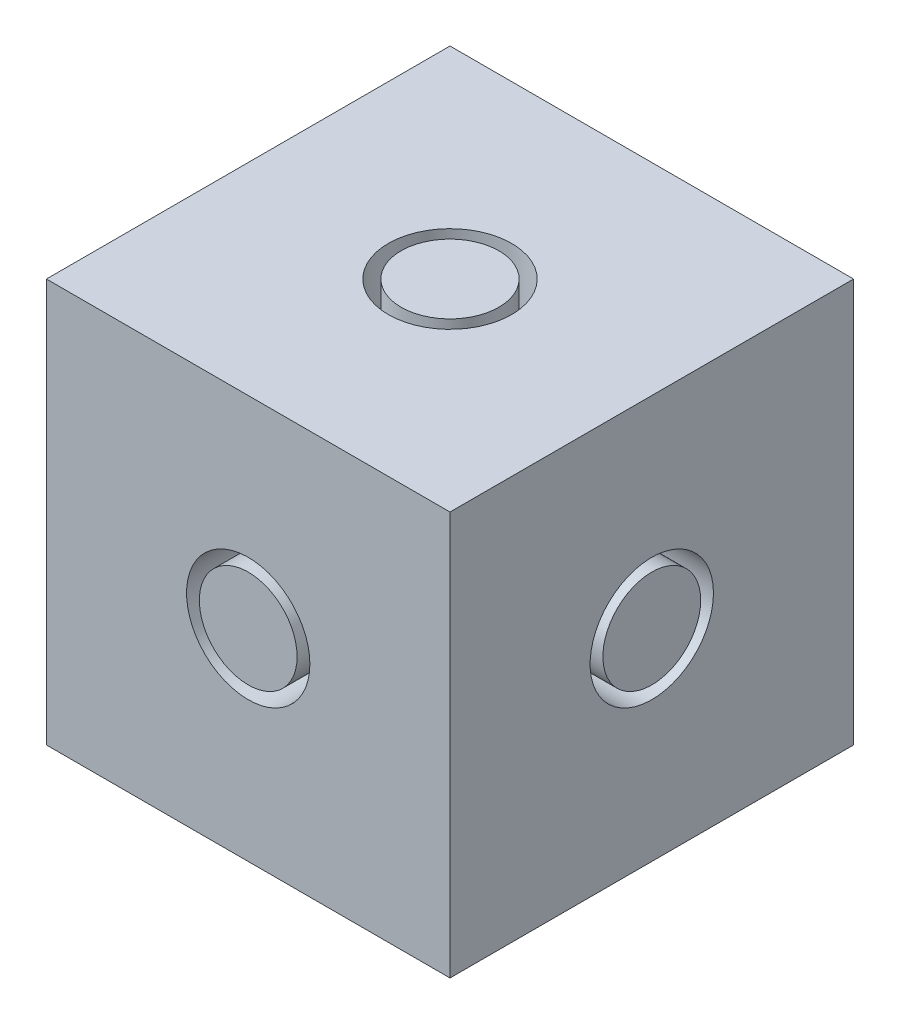
ISO-10303-21;
HEADER;
FILE_DESCRIPTION(('STEP AP214'),'2;1');
FILE_NAME('part.step','',(''),(''),'','','');
FILE_SCHEMA(('AUTOMOTIVE_DESIGN { 1 0 10303 214 1 1 1 1 }'));
ENDSEC;
DATA;
#1=APPLICATION_CONTEXT('core data for automotive mechanical design processes');
#2=APPLICATION_PROTOCOL_DEFINITION('international standard','automotive_design',2000,#1);
#3=PRODUCT_CONTEXT('',#1,'mechanical');
#4=PRODUCT('Part','Part','',(#3));
#5=PRODUCT_RELATED_PRODUCT_CATEGORY('part','',(#4));
#6=PRODUCT_DEFINITION_FORMATION('','',#4);
#7=PRODUCT_DEFINITION_CONTEXT('part definition',#1,'design');
#8=PRODUCT_DEFINITION('design','',#6,#7);
#9=PRODUCT_DEFINITION_SHAPE('','',#8);
#10=(LENGTH_UNIT() NAMED_UNIT(*) SI_UNIT(.MILLI.,.METRE.));
#11=(NAMED_UNIT(*) PLANE_ANGLE_UNIT() SI_UNIT($,.RADIAN.));
#12=(NAMED_UNIT(*) SI_UNIT($,.STERADIAN.) SOLID_ANGLE_UNIT());
#13=UNCERTAINTY_MEASURE_WITH_UNIT(LENGTH_MEASURE(1.E-05),#10,'distance_accuracy_value','');
#14=(GEOMETRIC_REPRESENTATION_CONTEXT(3) GLOBAL_UNCERTAINTY_ASSIGNED_CONTEXT((#13)) GLOBAL_UNIT_ASSIGNED_CONTEXT((#10,
#11,#12)) REPRESENTATION_CONTEXT('',''));
#15=CARTESIAN_POINT('',(0.,0.,0.));
#16=DIRECTION('',(0.,0.,1.));
#17=DIRECTION('',(1.,0.,0.));
#18=AXIS2_PLACEMENT_3D('',#15,#16,#17);
#19=CARTESIAN_POINT('',(27.65,27.65,-27.65));
#20=DIRECTION('',(-1.,0.,0.));
#21=DIRECTION('',(0.,0.,1.));
#22=AXIS2_PLACEMENT_3D('',#19,#20,#21);
#23=PLANE('',#22);
#24=CARTESIAN_POINT('',(27.65,0.,0.));
#25=DIRECTION('',(1.,0.,0.));
#26=DIRECTION('',(0.,0.,-1.));
#27=AXIS2_PLACEMENT_3D('',#24,#25,#26);
#28=CIRCLE('',#27,8.45);
#29=CARTESIAN_POINT('',(27.65,0.,-8.45));
#30=VERTEX_POINT('',#29);
#31=EDGE_CURVE('E160',#30,#30,#28,.T.);
#32=ORIENTED_EDGE('',*,*,#31,.F.);
#33=EDGE_LOOP('',(#32));
#34=FACE_BOUND('',#33,.T.);
#35=DIRECTION('',(0.,0.,-1.));
#36=VECTOR('',#35,1.);
#37=CARTESIAN_POINT('',(27.65,-27.65,-27.65));
#38=LINE('',#37,#36);
#39=CARTESIAN_POINT('',(27.65,-27.65,27.65));
#40=VERTEX_POINT('',#39);
#41=CARTESIAN_POINT('',(27.65,-27.65,-27.65));
#42=VERTEX_POINT('',#41);
#43=EDGE_CURVE('E107',#40,#42,#38,.T.);
#44=ORIENTED_EDGE('',*,*,#43,.T.);
#45=DIRECTION('',(0.,-1.,0.));
#46=VECTOR('',#45,1.);
#47=CARTESIAN_POINT('',(27.65,27.65,-27.65));
#48=LINE('',#47,#46);
#49=CARTESIAN_POINT('',(27.65,27.65,-27.65));
#50=VERTEX_POINT('',#49);
#51=EDGE_CURVE('E11',#50,#42,#48,.T.);
#52=ORIENTED_EDGE('',*,*,#51,.F.);
#53=DIRECTION('',(0.,0.,-1.));
#54=VECTOR('',#53,1.);
#55=CARTESIAN_POINT('',(27.65,27.65,-27.65));
#56=LINE('',#55,#54);
#57=CARTESIAN_POINT('',(27.65,27.65,27.65));
#58=VERTEX_POINT('',#57);
#59=EDGE_CURVE('E91',#58,#50,#56,.T.);
#60=ORIENTED_EDGE('',*,*,#59,.F.);
#61=DIRECTION('',(0.,-1.,0.));
#62=VECTOR('',#61,1.);
#63=CARTESIAN_POINT('',(27.65,27.65,27.65));
#64=LINE('',#63,#62);
#65=EDGE_CURVE('E103',#58,#40,#64,.T.);
#66=ORIENTED_EDGE('',*,*,#65,.T.);
#67=EDGE_LOOP('',(#44,#52,#60,#66));
#68=FACE_BOUND('',#67,.T.);
#69=ADVANCED_FACE('F39',(#34,#68),#23,.F.);
#70=CARTESIAN_POINT('',(-27.65,27.65,-27.65));
#71=DIRECTION('',(0.,0.,1.));
#72=DIRECTION('',(1.,0.,0.));
#73=AXIS2_PLACEMENT_3D('',#70,#71,#72);
#74=PLANE('',#73);
#75=CARTESIAN_POINT('',(0.,0.,-27.65));
#76=DIRECTION('',(0.,0.,-1.));
#77=DIRECTION('',(-1.,0.,0.));
#78=AXIS2_PLACEMENT_3D('',#75,#76,#77);
#79=CIRCLE('',#78,8.45);
#80=CARTESIAN_POINT('',(-8.45,0.,-27.65));
#81=VERTEX_POINT('',#80);
#82=EDGE_CURVE('E208',#81,#81,#79,.T.);
#83=ORIENTED_EDGE('',*,*,#82,.F.);
#84=EDGE_LOOP('',(#83));
#85=FACE_BOUND('',#84,.T.);
#86=DIRECTION('',(-1.,0.,0.));
#87=VECTOR('',#86,1.);
#88=CARTESIAN_POINT('',(-27.65,-27.65,-27.65));
#89=LINE('',#88,#87);
#90=CARTESIAN_POINT('',(-27.65,-27.65,-27.65));
#91=VERTEX_POINT('',#90);
#92=EDGE_CURVE('E96',#42,#91,#89,.T.);
#93=ORIENTED_EDGE('',*,*,#92,.T.);
#94=DIRECTION('',(0.,-1.,0.));
#95=VECTOR('',#94,1.);
#96=CARTESIAN_POINT('',(-27.65,27.65,-27.65));
#97=LINE('',#96,#95);
#98=CARTESIAN_POINT('',(-27.65,27.65,-27.65));
#99=VERTEX_POINT('',#98);
#100=EDGE_CURVE('E48',#99,#91,#97,.T.);
#101=ORIENTED_EDGE('',*,*,#100,.F.);
#102=DIRECTION('',(-1.,0.,0.));
#103=VECTOR('',#102,1.);
#104=CARTESIAN_POINT('',(-27.65,27.65,-27.65));
#105=LINE('',#104,#103);
#106=EDGE_CURVE('E86',#50,#99,#105,.T.);
#107=ORIENTED_EDGE('',*,*,#106,.F.);
#108=ORIENTED_EDGE('',*,*,#51,.T.);
#109=EDGE_LOOP('',(#93,#101,#107,#108));
#110=FACE_BOUND('',#109,.T.);
#111=ADVANCED_FACE('F95',(#85,#110),#74,.F.);
#112=CARTESIAN_POINT('',(-27.65,27.65,-27.65));
#113=DIRECTION('',(1.,0.,0.));
#114=DIRECTION('',(0.,0.,-1.));
#115=AXIS2_PLACEMENT_3D('',#112,#113,#114);
#116=PLANE('',#115);
#117=CARTESIAN_POINT('',(-27.65,0.,0.));
#118=DIRECTION('',(-1.,0.,0.));
#119=DIRECTION('',(0.,0.,1.));
#120=AXIS2_PLACEMENT_3D('',#117,#118,#119);
#121=CIRCLE('',#120,8.45);
#122=CARTESIAN_POINT('',(-27.65,0.,8.45));
#123=VERTEX_POINT('',#122);
#124=EDGE_CURVE('E176',#123,#123,#121,.T.);
#125=ORIENTED_EDGE('',*,*,#124,.F.);
#126=EDGE_LOOP('',(#125));
#127=FACE_BOUND('',#126,.T.);
#128=DIRECTION('',(0.,0.,1.));
#129=VECTOR('',#128,1.);
#130=CARTESIAN_POINT('',(-27.65,-27.65,-27.65));
#131=LINE('',#130,#129);
#132=CARTESIAN_POINT('',(-27.65,-27.65,27.65));
#133=VERTEX_POINT('',#132);
#134=EDGE_CURVE('E73',#91,#133,#131,.T.);
#135=ORIENTED_EDGE('',*,*,#134,.T.);
#136=DIRECTION('',(0.,-1.,0.));
#137=VECTOR('',#136,1.);
#138=CARTESIAN_POINT('',(-27.65,27.65,27.65));
#139=LINE('',#138,#137);
#140=CARTESIAN_POINT('',(-27.65,27.65,27.65));
#141=VERTEX_POINT('',#140);
#142=EDGE_CURVE('E98',#141,#133,#139,.T.);
#143=ORIENTED_EDGE('',*,*,#142,.F.);
#144=DIRECTION('',(0.,0.,1.));
#145=VECTOR('',#144,1.);
#146=CARTESIAN_POINT('',(-27.65,27.65,-27.65));
#147=LINE('',#146,#145);
#148=EDGE_CURVE('E89',#99,#141,#147,.T.);
#149=ORIENTED_EDGE('',*,*,#148,.F.);
#150=ORIENTED_EDGE('',*,*,#100,.T.);
#151=EDGE_LOOP('',(#135,#143,#149,#150));
#152=FACE_BOUND('',#151,.T.);
#153=ADVANCED_FACE('F99',(#127,#152),#116,.F.);
#154=CARTESIAN_POINT('',(-27.65,27.65,27.65));
#155=DIRECTION('',(0.,0.,-1.));
#156=DIRECTION('',(-1.,0.,0.));
#157=AXIS2_PLACEMENT_3D('',#154,#155,#156);
#158=PLANE('',#157);
#159=CARTESIAN_POINT('',(0.,0.,27.65));
#160=DIRECTION('',(0.,0.,1.));
#161=DIRECTION('',(1.,0.,0.));
#162=AXIS2_PLACEMENT_3D('',#159,#160,#161);
#163=CIRCLE('',#162,8.45);
#164=CARTESIAN_POINT('',(8.45,0.,27.65));
#165=VERTEX_POINT('',#164);
#166=EDGE_CURVE('E192',#165,#165,#163,.T.);
#167=ORIENTED_EDGE('',*,*,#166,.F.);
#168=EDGE_LOOP('',(#167));
#169=FACE_BOUND('',#168,.T.);
#170=DIRECTION('',(1.,0.,0.));
#171=VECTOR('',#170,1.);
#172=CARTESIAN_POINT('',(-27.65,-27.65,27.65));
#173=LINE('',#172,#171);
#174=EDGE_CURVE('E79',#133,#40,#173,.T.);
#175=ORIENTED_EDGE('',*,*,#174,.T.);
#176=ORIENTED_EDGE('',*,*,#65,.F.);
#177=DIRECTION('',(1.,0.,0.));
#178=VECTOR('',#177,1.);
#179=CARTESIAN_POINT('',(-27.65,27.65,27.65));
#180=LINE('',#179,#178);
#181=EDGE_CURVE('E56',#141,#58,#180,.T.);
#182=ORIENTED_EDGE('',*,*,#181,.F.);
#183=ORIENTED_EDGE('',*,*,#142,.T.);
#184=EDGE_LOOP('',(#175,#176,#182,#183));
#185=FACE_BOUND('',#184,.T.);
#186=ADVANCED_FACE('F121',(#169,#185),#158,.F.);
#187=CARTESIAN_POINT('',(0.,27.65,0.));
#188=DIRECTION('',(0.,1.,0.));
#189=DIRECTION('',(0.,0.,1.));
#190=AXIS2_PLACEMENT_3D('',#187,#188,#189);
#191=PLANE('',#190);
#192=CARTESIAN_POINT('',(0.,27.65,0.));
#193=DIRECTION('',(0.,1.,0.));
#194=DIRECTION('',(0.,0.,1.));
#195=AXIS2_PLACEMENT_3D('',#192,#193,#194);
#196=CIRCLE('',#195,8.45);
#197=CARTESIAN_POINT('',(0.,27.65,8.45));
#198=VERTEX_POINT('',#197);
#199=EDGE_CURVE('E128',#198,#198,#196,.T.);
#200=ORIENTED_EDGE('',*,*,#199,.F.);
#201=EDGE_LOOP('',(#200));
#202=FACE_BOUND('',#201,.T.);
#203=ORIENTED_EDGE('',*,*,#59,.T.);
#204=ORIENTED_EDGE('',*,*,#106,.T.);
#205=ORIENTED_EDGE('',*,*,#148,.T.);
#206=ORIENTED_EDGE('',*,*,#181,.T.);
#207=EDGE_LOOP('',(#203,#204,#205,#206));
#208=FACE_BOUND('',#207,.T.);
#209=ADVANCED_FACE('F87',(#202,#208),#191,.T.);
#210=CARTESIAN_POINT('',(0.,-27.65,0.));
#211=DIRECTION('',(0.,1.,0.));
#212=DIRECTION('',(0.,0.,1.));
#213=AXIS2_PLACEMENT_3D('',#210,#211,#212);
#214=PLANE('',#213);
#215=CARTESIAN_POINT('',(0.,-27.65,0.));
#216=DIRECTION('',(0.,-1.,0.));
#217=DIRECTION('',(0.,0.,-1.));
#218=AXIS2_PLACEMENT_3D('',#215,#216,#217);
#219=CIRCLE('',#218,8.45);
#220=CARTESIAN_POINT('',(0.,-27.65,-8.45));
#221=VERTEX_POINT('',#220);
#222=EDGE_CURVE('E144',#221,#221,#219,.T.);
#223=ORIENTED_EDGE('',*,*,#222,.F.);
#224=EDGE_LOOP('',(#223));
#225=FACE_BOUND('',#224,.T.);
#226=ORIENTED_EDGE('',*,*,#43,.F.);
#227=ORIENTED_EDGE('',*,*,#174,.F.);
#228=ORIENTED_EDGE('',*,*,#134,.F.);
#229=ORIENTED_EDGE('',*,*,#92,.F.);
#230=EDGE_LOOP('',(#226,#227,#228,#229));
#231=FACE_BOUND('',#230,.T.);
#232=ADVANCED_FACE('F124',(#225,#231),#214,.F.);
#233=CARTESIAN_POINT('',(0.,18.15,0.));
#234=DIRECTION('',(0.,1.,0.));
#235=DIRECTION('',(0.,0.,1.));
#236=AXIS2_PLACEMENT_3D('',#233,#234,#235);
#237=CYLINDRICAL_SURFACE('',#236,8.45);
#238=CARTESIAN_POINT('',(0.,18.15,0.));
#239=DIRECTION('',(0.,1.,0.));
#240=DIRECTION('',(0.,0.,1.));
#241=AXIS2_PLACEMENT_3D('',#238,#239,#240);
#242=CIRCLE('',#241,8.45);
#243=CARTESIAN_POINT('',(0.,18.15,8.45));
#244=VERTEX_POINT('',#243);
#245=EDGE_CURVE('E111',#244,#244,#242,.T.);
#246=ORIENTED_EDGE('',*,*,#245,.F.);
#247=EDGE_LOOP('',(#246));
#248=FACE_BOUND('',#247,.T.);
#249=ORIENTED_EDGE('',*,*,#199,.T.);
#250=EDGE_LOOP('',(#249));
#251=FACE_BOUND('',#250,.T.);
#252=ADVANCED_FACE('F318',(#248,#251),#237,.F.);
#253=CARTESIAN_POINT('',(0.,18.15,0.));
#254=DIRECTION('',(0.,1.,0.));
#255=DIRECTION('',(0.,0.,1.));
#256=AXIS2_PLACEMENT_3D('',#253,#254,#255);
#257=PLANE('',#256);
#258=CARTESIAN_POINT('',(0.,18.15,0.));
#259=DIRECTION('',(0.,1.,0.));
#260=DIRECTION('',(0.,0.,1.));
#261=AXIS2_PLACEMENT_3D('',#258,#259,#260);
#262=CIRCLE('',#261,6.7);
#263=CARTESIAN_POINT('',(0.,18.15,6.7));
#264=VERTEX_POINT('',#263);
#265=EDGE_CURVE('E132',#264,#264,#262,.T.);
#266=ORIENTED_EDGE('',*,*,#265,.F.);
#267=EDGE_LOOP('',(#266));
#268=FACE_BOUND('',#267,.T.);
#269=ORIENTED_EDGE('',*,*,#245,.T.);
#270=EDGE_LOOP('',(#269));
#271=FACE_BOUND('',#270,.T.);
#272=ADVANCED_FACE('F314',(#268,#271),#257,.T.);
#273=CARTESIAN_POINT('',(0.,18.15,0.));
#274=DIRECTION('',(0.,1.,0.));
#275=DIRECTION('',(0.,0.,1.));
#276=AXIS2_PLACEMENT_3D('',#273,#274,#275);
#277=CYLINDRICAL_SURFACE('',#276,6.7);
#278=ORIENTED_EDGE('',*,*,#265,.T.);
#279=EDGE_LOOP('',(#278));
#280=FACE_BOUND('',#279,.T.);
#281=CARTESIAN_POINT('',(0.,27.65,0.));
#282=DIRECTION('',(0.,1.,0.));
#283=DIRECTION('',(0.,0.,1.));
#284=AXIS2_PLACEMENT_3D('',#281,#282,#283);
#285=CIRCLE('',#284,6.7);
#286=CARTESIAN_POINT('',(0.,27.65,6.7));
#287=VERTEX_POINT('',#286);
#288=EDGE_CURVE('E136',#287,#287,#285,.T.);
#289=ORIENTED_EDGE('',*,*,#288,.F.);
#290=EDGE_LOOP('',(#289));
#291=FACE_BOUND('',#290,.T.);
#292=ADVANCED_FACE('F311',(#280,#291),#277,.T.);
#293=ORIENTED_EDGE('',*,*,#288,.T.);
#294=EDGE_LOOP('',(#293));
#295=FACE_BOUND('',#294,.T.);
#296=ADVANCED_FACE('F309',(#295),#191,.T.);
#297=CARTESIAN_POINT('',(0.,-18.15,0.));
#298=DIRECTION('',(0.,-1.,0.));
#299=DIRECTION('',(0.,0.,-1.));
#300=AXIS2_PLACEMENT_3D('',#297,#298,#299);
#301=CYLINDRICAL_SURFACE('',#300,8.45);
#302=CARTESIAN_POINT('',(0.,-18.15,0.));
#303=DIRECTION('',(0.,-1.,0.));
#304=DIRECTION('',(0.,0.,-1.));
#305=AXIS2_PLACEMENT_3D('',#302,#303,#304);
#306=CIRCLE('',#305,8.45);
#307=CARTESIAN_POINT('',(0.,-18.15,-8.45));
#308=VERTEX_POINT('',#307);
#309=EDGE_CURVE('E140',#308,#308,#306,.T.);
#310=ORIENTED_EDGE('',*,*,#309,.F.);
#311=EDGE_LOOP('',(#310));
#312=FACE_BOUND('',#311,.T.);
#313=ORIENTED_EDGE('',*,*,#222,.T.);
#314=EDGE_LOOP('',(#313));
#315=FACE_BOUND('',#314,.T.);
#316=ADVANCED_FACE('F305',(#312,#315),#301,.F.);
#317=CARTESIAN_POINT('',(0.,-18.15,0.));
#318=DIRECTION('',(0.,-1.,0.));
#319=DIRECTION('',(0.,0.,-1.));
#320=AXIS2_PLACEMENT_3D('',#317,#318,#319);
#321=PLANE('',#320);
#322=CARTESIAN_POINT('',(0.,-18.15,0.));
#323=DIRECTION('',(0.,-1.,0.));
#324=DIRECTION('',(0.,0.,-1.));
#325=AXIS2_PLACEMENT_3D('',#322,#323,#324);
#326=CIRCLE('',#325,6.7);
#327=CARTESIAN_POINT('',(0.,-18.15,-6.7));
#328=VERTEX_POINT('',#327);
#329=EDGE_CURVE('E148',#328,#328,#326,.T.);
#330=ORIENTED_EDGE('',*,*,#329,.F.);
#331=EDGE_LOOP('',(#330));
#332=FACE_BOUND('',#331,.T.);
#333=ORIENTED_EDGE('',*,*,#309,.T.);
#334=EDGE_LOOP('',(#333));
#335=FACE_BOUND('',#334,.T.);
#336=ADVANCED_FACE('F301',(#332,#335),#321,.T.);
#337=CARTESIAN_POINT('',(0.,-18.15,0.));
#338=DIRECTION('',(0.,-1.,0.));
#339=DIRECTION('',(0.,0.,-1.));
#340=AXIS2_PLACEMENT_3D('',#337,#338,#339);
#341=CYLINDRICAL_SURFACE('',#340,6.7);
#342=ORIENTED_EDGE('',*,*,#329,.T.);
#343=EDGE_LOOP('',(#342));
#344=FACE_BOUND('',#343,.T.);
#345=CARTESIAN_POINT('',(0.,-27.65,0.));
#346=DIRECTION('',(0.,-1.,0.));
#347=DIRECTION('',(0.,0.,-1.));
#348=AXIS2_PLACEMENT_3D('',#345,#346,#347);
#349=CIRCLE('',#348,6.7);
#350=CARTESIAN_POINT('',(0.,-27.65,-6.7));
#351=VERTEX_POINT('',#350);
#352=EDGE_CURVE('E152',#351,#351,#349,.T.);
#353=ORIENTED_EDGE('',*,*,#352,.F.);
#354=EDGE_LOOP('',(#353));
#355=FACE_BOUND('',#354,.T.);
#356=ADVANCED_FACE('F298',(#344,#355),#341,.T.);
#357=ORIENTED_EDGE('',*,*,#352,.T.);
#358=EDGE_LOOP('',(#357));
#359=FACE_BOUND('',#358,.T.);
#360=ADVANCED_FACE('F296',(#359),#214,.F.);
#361=CARTESIAN_POINT('',(18.15,0.,0.));
#362=DIRECTION('',(1.,0.,0.));
#363=DIRECTION('',(0.,0.,-1.));
#364=AXIS2_PLACEMENT_3D('',#361,#362,#363);
#365=CYLINDRICAL_SURFACE('',#364,8.45);
#366=CARTESIAN_POINT('',(18.15,0.,0.));
#367=DIRECTION('',(1.,0.,0.));
#368=DIRECTION('',(0.,0.,-1.));
#369=AXIS2_PLACEMENT_3D('',#366,#367,#368);
#370=CIRCLE('',#369,8.45);
#371=CARTESIAN_POINT('',(18.15,0.,-8.45));
#372=VERTEX_POINT('',#371);
#373=EDGE_CURVE('E156',#372,#372,#370,.T.);
#374=ORIENTED_EDGE('',*,*,#373,.F.);
#375=EDGE_LOOP('',(#374));
#376=FACE_BOUND('',#375,.T.);
#377=ORIENTED_EDGE('',*,*,#31,.T.);
#378=EDGE_LOOP('',(#377));
#379=FACE_BOUND('',#378,.T.);
#380=ADVANCED_FACE('F292',(#376,#379),#365,.F.);
#381=CARTESIAN_POINT('',(18.15,0.,0.));
#382=DIRECTION('',(1.,0.,0.));
#383=DIRECTION('',(0.,0.,-1.));
#384=AXIS2_PLACEMENT_3D('',#381,#382,#383);
#385=PLANE('',#384);
#386=CARTESIAN_POINT('',(18.15,0.,0.));
#387=DIRECTION('',(1.,0.,0.));
#388=DIRECTION('',(0.,0.,-1.));
#389=AXIS2_PLACEMENT_3D('',#386,#387,#388);
#390=CIRCLE('',#389,6.7);
#391=CARTESIAN_POINT('',(18.15,0.,-6.7));
#392=VERTEX_POINT('',#391);
#393=EDGE_CURVE('E164',#392,#392,#390,.T.);
#394=ORIENTED_EDGE('',*,*,#393,.F.);
#395=EDGE_LOOP('',(#394));
#396=FACE_BOUND('',#395,.T.);
#397=ORIENTED_EDGE('',*,*,#373,.T.);
#398=EDGE_LOOP('',(#397));
#399=FACE_BOUND('',#398,.T.);
#400=ADVANCED_FACE('F288',(#396,#399),#385,.T.);
#401=CARTESIAN_POINT('',(18.15,0.,0.));
#402=DIRECTION('',(1.,0.,0.));
#403=DIRECTION('',(0.,0.,-1.));
#404=AXIS2_PLACEMENT_3D('',#401,#402,#403);
#405=CYLINDRICAL_SURFACE('',#404,6.7);
#406=ORIENTED_EDGE('',*,*,#393,.T.);
#407=EDGE_LOOP('',(#406));
#408=FACE_BOUND('',#407,.T.);
#409=CARTESIAN_POINT('',(27.65,0.,0.));
#410=DIRECTION('',(1.,0.,0.));
#411=DIRECTION('',(0.,0.,-1.));
#412=AXIS2_PLACEMENT_3D('',#409,#410,#411);
#413=CIRCLE('',#412,6.7);
#414=CARTESIAN_POINT('',(27.65,0.,-6.7));
#415=VERTEX_POINT('',#414);
#416=EDGE_CURVE('E168',#415,#415,#413,.T.);
#417=ORIENTED_EDGE('',*,*,#416,.F.);
#418=EDGE_LOOP('',(#417));
#419=FACE_BOUND('',#418,.T.);
#420=ADVANCED_FACE('F285',(#408,#419),#405,.T.);
#421=ORIENTED_EDGE('',*,*,#416,.T.);
#422=EDGE_LOOP('',(#421));
#423=FACE_BOUND('',#422,.T.);
#424=ADVANCED_FACE('F250',(#423),#23,.F.);
#425=CARTESIAN_POINT('',(-18.15,0.,0.));
#426=DIRECTION('',(-1.,0.,0.));
#427=DIRECTION('',(0.,0.,1.));
#428=AXIS2_PLACEMENT_3D('',#425,#426,#427);
#429=CYLINDRICAL_SURFACE('',#428,8.45);
#430=CARTESIAN_POINT('',(-18.15,0.,0.));
#431=DIRECTION('',(-1.,0.,0.));
#432=DIRECTION('',(0.,0.,1.));
#433=AXIS2_PLACEMENT_3D('',#430,#431,#432);
#434=CIRCLE('',#433,8.45);
#435=CARTESIAN_POINT('',(-18.15,0.,8.45));
#436=VERTEX_POINT('',#435);
#437=EDGE_CURVE('E172',#436,#436,#434,.T.);
#438=ORIENTED_EDGE('',*,*,#437,.F.);
#439=EDGE_LOOP('',(#438));
#440=FACE_BOUND('',#439,.T.);
#441=ORIENTED_EDGE('',*,*,#124,.T.);
#442=EDGE_LOOP('',(#441));
#443=FACE_BOUND('',#442,.T.);
#444=ADVANCED_FACE('F280',(#440,#443),#429,.F.);
#445=CARTESIAN_POINT('',(-18.15,0.,0.));
#446=DIRECTION('',(-1.,0.,0.));
#447=DIRECTION('',(0.,0.,1.));
#448=AXIS2_PLACEMENT_3D('',#445,#446,#447);
#449=PLANE('',#448);
#450=CARTESIAN_POINT('',(-18.15,0.,0.));
#451=DIRECTION('',(-1.,0.,0.));
#452=DIRECTION('',(0.,0.,1.));
#453=AXIS2_PLACEMENT_3D('',#450,#451,#452);
#454=CIRCLE('',#453,6.7);
#455=CARTESIAN_POINT('',(-18.15,0.,6.7));
#456=VERTEX_POINT('',#455);
#457=EDGE_CURVE('E180',#456,#456,#454,.T.);
#458=ORIENTED_EDGE('',*,*,#457,.F.);
#459=EDGE_LOOP('',(#458));
#460=FACE_BOUND('',#459,.T.);
#461=ORIENTED_EDGE('',*,*,#437,.T.);
#462=EDGE_LOOP('',(#461));
#463=FACE_BOUND('',#462,.T.);
#464=ADVANCED_FACE('F276',(#460,#463),#449,.T.);
#465=CARTESIAN_POINT('',(-18.15,0.,0.));
#466=DIRECTION('',(-1.,0.,0.));
#467=DIRECTION('',(0.,0.,1.));
#468=AXIS2_PLACEMENT_3D('',#465,#466,#467);
#469=CYLINDRICAL_SURFACE('',#468,6.7);
#470=ORIENTED_EDGE('',*,*,#457,.T.);
#471=EDGE_LOOP('',(#470));
#472=FACE_BOUND('',#471,.T.);
#473=CARTESIAN_POINT('',(-27.65,0.,0.));
#474=DIRECTION('',(-1.,0.,0.));
#475=DIRECTION('',(0.,0.,1.));
#476=AXIS2_PLACEMENT_3D('',#473,#474,#475);
#477=CIRCLE('',#476,6.7);
#478=CARTESIAN_POINT('',(-27.65,0.,6.7));
#479=VERTEX_POINT('',#478);
#480=EDGE_CURVE('E184',#479,#479,#477,.T.);
#481=ORIENTED_EDGE('',*,*,#480,.F.);
#482=EDGE_LOOP('',(#481));
#483=FACE_BOUND('',#482,.T.);
#484=ADVANCED_FACE('F273',(#472,#483),#469,.T.);
#485=ORIENTED_EDGE('',*,*,#480,.T.);
#486=EDGE_LOOP('',(#485));
#487=FACE_BOUND('',#486,.T.);
#488=ADVANCED_FACE('F248',(#487),#116,.F.);
#489=CARTESIAN_POINT('',(0.,0.,18.15));
#490=DIRECTION('',(0.,0.,1.));
#491=DIRECTION('',(1.,0.,0.));
#492=AXIS2_PLACEMENT_3D('',#489,#490,#491);
#493=CYLINDRICAL_SURFACE('',#492,8.45);
#494=CARTESIAN_POINT('',(0.,0.,18.15));
#495=DIRECTION('',(0.,0.,1.));
#496=DIRECTION('',(1.,0.,0.));
#497=AXIS2_PLACEMENT_3D('',#494,#495,#496);
#498=CIRCLE('',#497,8.45);
#499=CARTESIAN_POINT('',(8.45,0.,18.15));
#500=VERTEX_POINT('',#499);
#501=EDGE_CURVE('E188',#500,#500,#498,.T.);
#502=ORIENTED_EDGE('',*,*,#501,.F.);
#503=EDGE_LOOP('',(#502));
#504=FACE_BOUND('',#503,.T.);
#505=ORIENTED_EDGE('',*,*,#166,.T.);
#506=EDGE_LOOP('',(#505));
#507=FACE_BOUND('',#506,.T.);
#508=ADVANCED_FACE('F268',(#504,#507),#493,.F.);
#509=CARTESIAN_POINT('',(0.,0.,18.15));
#510=DIRECTION('',(0.,0.,1.));
#511=DIRECTION('',(1.,0.,0.));
#512=AXIS2_PLACEMENT_3D('',#509,#510,#511);
#513=PLANE('',#512);
#514=CARTESIAN_POINT('',(0.,0.,18.15));
#515=DIRECTION('',(0.,0.,1.));
#516=DIRECTION('',(1.,0.,0.));
#517=AXIS2_PLACEMENT_3D('',#514,#515,#516);
#518=CIRCLE('',#517,6.7);
#519=CARTESIAN_POINT('',(6.7,0.,18.15));
#520=VERTEX_POINT('',#519);
#521=EDGE_CURVE('E196',#520,#520,#518,.T.);
#522=ORIENTED_EDGE('',*,*,#521,.F.);
#523=EDGE_LOOP('',(#522));
#524=FACE_BOUND('',#523,.T.);
#525=ORIENTED_EDGE('',*,*,#501,.T.);
#526=EDGE_LOOP('',(#525));
#527=FACE_BOUND('',#526,.T.);
#528=ADVANCED_FACE('F264',(#524,#527),#513,.T.);
#529=CARTESIAN_POINT('',(0.,0.,18.15));
#530=DIRECTION('',(0.,0.,1.));
#531=DIRECTION('',(1.,0.,0.));
#532=AXIS2_PLACEMENT_3D('',#529,#530,#531);
#533=CYLINDRICAL_SURFACE('',#532,6.7);
#534=ORIENTED_EDGE('',*,*,#521,.T.);
#535=EDGE_LOOP('',(#534));
#536=FACE_BOUND('',#535,.T.);
#537=CARTESIAN_POINT('',(0.,0.,27.65));
#538=DIRECTION('',(0.,0.,1.));
#539=DIRECTION('',(1.,0.,0.));
#540=AXIS2_PLACEMENT_3D('',#537,#538,#539);
#541=CIRCLE('',#540,6.7);
#542=CARTESIAN_POINT('',(6.7,0.,27.65));
#543=VERTEX_POINT('',#542);
#544=EDGE_CURVE('E200',#543,#543,#541,.T.);
#545=ORIENTED_EDGE('',*,*,#544,.F.);
#546=EDGE_LOOP('',(#545));
#547=FACE_BOUND('',#546,.T.);
#548=ADVANCED_FACE('F261',(#536,#547),#533,.T.);
#549=ORIENTED_EDGE('',*,*,#544,.T.);
#550=EDGE_LOOP('',(#549));
#551=FACE_BOUND('',#550,.T.);
#552=ADVANCED_FACE('F236',(#551),#158,.F.);
#553=CARTESIAN_POINT('',(0.,0.,-18.15));
#554=DIRECTION('',(0.,0.,-1.));
#555=DIRECTION('',(-1.,0.,0.));
#556=AXIS2_PLACEMENT_3D('',#553,#554,#555);
#557=CYLINDRICAL_SURFACE('',#556,8.45);
#558=CARTESIAN_POINT('',(0.,0.,-18.15));
#559=DIRECTION('',(0.,0.,-1.));
#560=DIRECTION('',(-1.,0.,0.));
#561=AXIS2_PLACEMENT_3D('',#558,#559,#560);
#562=CIRCLE('',#561,8.45);
#563=CARTESIAN_POINT('',(-8.45,0.,-18.15));
#564=VERTEX_POINT('',#563);
#565=EDGE_CURVE('E204',#564,#564,#562,.T.);
#566=ORIENTED_EDGE('',*,*,#565,.F.);
#567=EDGE_LOOP('',(#566));
#568=FACE_BOUND('',#567,.T.);
#569=ORIENTED_EDGE('',*,*,#82,.T.);
#570=EDGE_LOOP('',(#569));
#571=FACE_BOUND('',#570,.T.);
#572=ADVANCED_FACE('F230',(#568,#571),#557,.F.);
#573=CARTESIAN_POINT('',(0.,0.,-18.15));
#574=DIRECTION('',(0.,0.,-1.));
#575=DIRECTION('',(-1.,0.,0.));
#576=AXIS2_PLACEMENT_3D('',#573,#574,#575);
#577=PLANE('',#576);
#578=CARTESIAN_POINT('',(0.,0.,-18.15));
#579=DIRECTION('',(0.,0.,-1.));
#580=DIRECTION('',(-1.,0.,0.));
#581=AXIS2_PLACEMENT_3D('',#578,#579,#580);
#582=CIRCLE('',#581,6.7);
#583=CARTESIAN_POINT('',(-6.7,0.,-18.15));
#584=VERTEX_POINT('',#583);
#585=EDGE_CURVE('E212',#584,#584,#582,.T.);
#586=ORIENTED_EDGE('',*,*,#585,.F.);
#587=EDGE_LOOP('',(#586));
#588=FACE_BOUND('',#587,.T.);
#589=ORIENTED_EDGE('',*,*,#565,.T.);
#590=EDGE_LOOP('',(#589));
#591=FACE_BOUND('',#590,.T.);
#592=ADVANCED_FACE('F227',(#588,#591),#577,.T.);
#593=CARTESIAN_POINT('',(0.,0.,-18.15));
#594=DIRECTION('',(0.,0.,-1.));
#595=DIRECTION('',(-1.,0.,0.));
#596=AXIS2_PLACEMENT_3D('',#593,#594,#595);
#597=CYLINDRICAL_SURFACE('',#596,6.7);
#598=ORIENTED_EDGE('',*,*,#585,.T.);
#599=EDGE_LOOP('',(#598));
#600=FACE_BOUND('',#599,.T.);
#601=CARTESIAN_POINT('',(0.,0.,-27.65));
#602=DIRECTION('',(0.,0.,-1.));
#603=DIRECTION('',(-1.,0.,0.));
#604=AXIS2_PLACEMENT_3D('',#601,#602,#603);
#605=CIRCLE('',#604,6.7);
#606=CARTESIAN_POINT('',(-6.7,0.,-27.65));
#607=VERTEX_POINT('',#606);
#608=EDGE_CURVE('E216',#607,#607,#605,.T.);
#609=ORIENTED_EDGE('',*,*,#608,.F.);
#610=EDGE_LOOP('',(#609));
#611=FACE_BOUND('',#610,.T.);
#612=ADVANCED_FACE('F224',(#600,#611),#597,.T.);
#613=ORIENTED_EDGE('',*,*,#608,.T.);
#614=EDGE_LOOP('',(#613));
#615=FACE_BOUND('',#614,.T.);
#616=ADVANCED_FACE('F241',(#615),#74,.F.);
#617=CLOSED_SHELL('',(#69,#111,#153,#186,#209,#232,#252,#272,#292,#296,#316,#336,#356,#360,#380,
#400,#420,#424,#444,#464,#484,#488,#508,#528,#548,#552,#572,#592,#612,#616));
#618=MANIFOLD_SOLID_BREP('B2',#617);
#619=ADVANCED_BREP_SHAPE_REPRESENTATION('',(#18,#618),#14);
#620=SHAPE_DEFINITION_REPRESENTATION(#9,#619);
ENDSEC;
END-ISO-10303-21;
